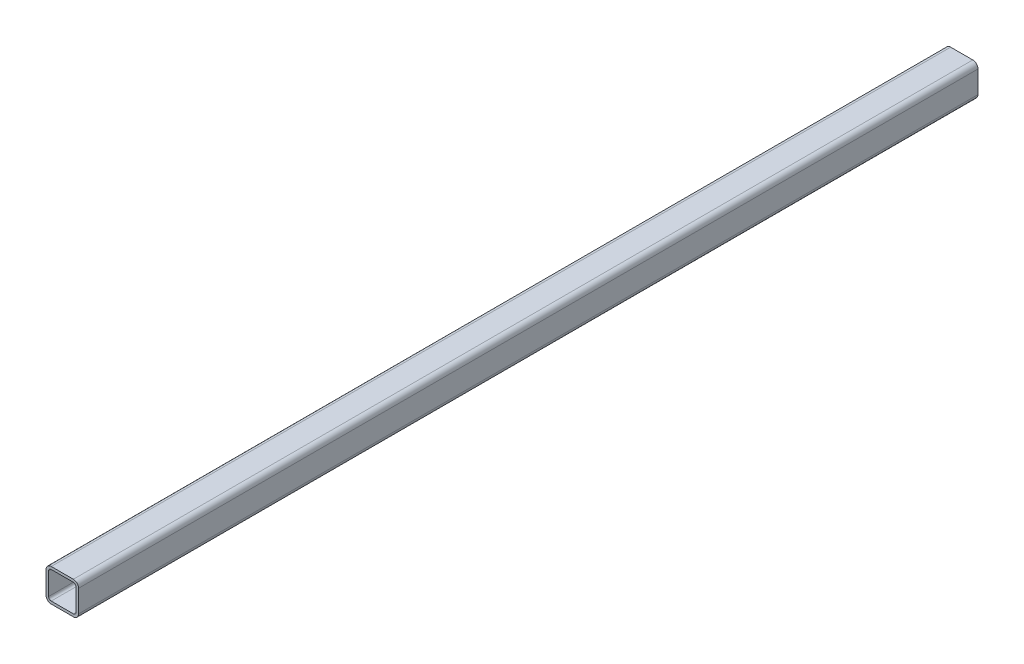
ISO-10303-21;
HEADER;
FILE_DESCRIPTION(('STEP AP214'),'2;1');
FILE_NAME('part.step','',(''),(''),'','','');
FILE_SCHEMA(('AUTOMOTIVE_DESIGN { 1 0 10303 214 1 1 1 1 }'));
ENDSEC;
DATA;
#1=APPLICATION_CONTEXT('core data for automotive mechanical design processes');
#2=APPLICATION_PROTOCOL_DEFINITION('international standard','automotive_design',2000,#1);
#3=PRODUCT_CONTEXT('',#1,'mechanical');
#4=PRODUCT('Part','Part','',(#3));
#5=PRODUCT_RELATED_PRODUCT_CATEGORY('part','',(#4));
#6=PRODUCT_DEFINITION_FORMATION('','',#4);
#7=PRODUCT_DEFINITION_CONTEXT('part definition',#1,'design');
#8=PRODUCT_DEFINITION('design','',#6,#7);
#9=PRODUCT_DEFINITION_SHAPE('','',#8);
#10=(LENGTH_UNIT() NAMED_UNIT(*) SI_UNIT(.MILLI.,.METRE.));
#11=(NAMED_UNIT(*) PLANE_ANGLE_UNIT() SI_UNIT($,.RADIAN.));
#12=(NAMED_UNIT(*) SI_UNIT($,.STERADIAN.) SOLID_ANGLE_UNIT());
#13=UNCERTAINTY_MEASURE_WITH_UNIT(LENGTH_MEASURE(1.E-05),#10,'distance_accuracy_value','');
#14=(GEOMETRIC_REPRESENTATION_CONTEXT(3) GLOBAL_UNCERTAINTY_ASSIGNED_CONTEXT((#13)) GLOBAL_UNIT_ASSIGNED_CONTEXT((#10,
#11,#12)) REPRESENTATION_CONTEXT('',''));
#15=CARTESIAN_POINT('',(0.,0.,0.));
#16=DIRECTION('',(0.,0.,1.));
#17=DIRECTION('',(1.,0.,0.));
#18=AXIS2_PLACEMENT_3D('',#15,#16,#17);
#19=CARTESIAN_POINT('',(-1206.,-1224.,220.));
#20=DIRECTION('',(-1.,0.,0.));
#21=DIRECTION('',(0.,0.,1.));
#22=AXIS2_PLACEMENT_3D('',#19,#20,#21);
#23=CYLINDRICAL_SURFACE('',#22,2.49999999999995);
#24=CARTESIAN_POINT('',(-1200.,-1224.,220.));
#25=DIRECTION('',(-1.,0.,0.));
#26=DIRECTION('',(0.,0.,1.));
#27=AXIS2_PLACEMENT_3D('',#24,#25,#26);
#28=CIRCLE('',#27,2.49999999999995);
#29=CARTESIAN_POINT('',(-1200.,-1224.,222.5));
#30=VERTEX_POINT('',#29);
#31=EDGE_CURVE('E22',#30,#30,#28,.T.);
#32=ORIENTED_EDGE('',*,*,#31,.T.);
#33=EDGE_LOOP('',(#32));
#34=FACE_BOUND('',#33,.T.);
#35=CARTESIAN_POINT('',(-1196.8,-1224.,220.));
#36=DIRECTION('',(-1.,0.,0.));
#37=DIRECTION('',(0.,0.,1.));
#38=AXIS2_PLACEMENT_3D('',#35,#36,#37);
#39=CIRCLE('',#38,2.49999999999995);
#40=CARTESIAN_POINT('',(-1196.8,-1224.,222.5));
#41=VERTEX_POINT('',#40);
#42=EDGE_CURVE('E167',#41,#41,#39,.T.);
#43=ORIENTED_EDGE('',*,*,#42,.F.);
#44=EDGE_LOOP('',(#43));
#45=FACE_BOUND('',#44,.T.);
#46=ADVANCED_FACE('F19',(#34,#45),#23,.F.);
#47=CARTESIAN_POINT('',(-1206.,-1224.,100.));
#48=DIRECTION('',(-1.,0.,0.));
#49=DIRECTION('',(0.,0.,1.));
#50=AXIS2_PLACEMENT_3D('',#47,#48,#49);
#51=CYLINDRICAL_SURFACE('',#50,2.49999999999995);
#52=CARTESIAN_POINT('',(-1200.,-1224.,100.));
#53=DIRECTION('',(-1.,0.,0.));
#54=DIRECTION('',(0.,0.,1.));
#55=AXIS2_PLACEMENT_3D('',#52,#53,#54);
#56=CIRCLE('',#55,2.49999999999995);
#57=CARTESIAN_POINT('',(-1200.,-1224.,102.5));
#58=VERTEX_POINT('',#57);
#59=EDGE_CURVE('E279',#58,#58,#56,.T.);
#60=ORIENTED_EDGE('',*,*,#59,.T.);
#61=EDGE_LOOP('',(#60));
#62=FACE_BOUND('',#61,.T.);
#63=CARTESIAN_POINT('',(-1196.8,-1224.,100.));
#64=DIRECTION('',(-1.,0.,0.));
#65=DIRECTION('',(0.,0.,1.));
#66=AXIS2_PLACEMENT_3D('',#63,#64,#65);
#67=CIRCLE('',#66,2.49999999999995);
#68=CARTESIAN_POINT('',(-1196.8,-1224.,102.5));
#69=VERTEX_POINT('',#68);
#70=EDGE_CURVE('E162',#69,#69,#67,.T.);
#71=ORIENTED_EDGE('',*,*,#70,.F.);
#72=EDGE_LOOP('',(#71));
#73=FACE_BOUND('',#72,.T.);
#74=ADVANCED_FACE('F444',(#62,#73),#51,.F.);
#75=CARTESIAN_POINT('',(-1200.,-1206.4,-880.));
#76=DIRECTION('',(1.,0.,0.));
#77=DIRECTION('',(0.,0.,-1.));
#78=AXIS2_PLACEMENT_3D('',#75,#76,#77);
#79=PLANE('',#78);
#80=ORIENTED_EDGE('',*,*,#59,.F.);
#81=EDGE_LOOP('',(#80));
#82=FACE_BOUND('',#81,.T.);
#83=ORIENTED_EDGE('',*,*,#31,.F.);
#84=EDGE_LOOP('',(#83));
#85=FACE_BOUND('',#84,.T.);
#86=DIRECTION('',(0.,0.,1.));
#87=VECTOR('',#86,1.);
#88=CARTESIAN_POINT('',(-1200.,-1206.4,-880.));
#89=LINE('',#88,#87);
#90=CARTESIAN_POINT('',(-1200.,-1206.4,-860.));
#91=VERTEX_POINT('',#90);
#92=CARTESIAN_POINT('',(-1200.,-1206.4,245.));
#93=VERTEX_POINT('',#92);
#94=EDGE_CURVE('E274',#91,#93,#89,.T.);
#95=ORIENTED_EDGE('',*,*,#94,.F.);
#96=DIRECTION('',(0.,1.,0.));
#97=VECTOR('',#96,1.);
#98=CARTESIAN_POINT('',(-1200.,-1240.,-860.));
#99=LINE('',#98,#97);
#100=CARTESIAN_POINT('',(-1200.,-1233.6,-860.));
#101=VERTEX_POINT('',#100);
#102=EDGE_CURVE('E199',#101,#91,#99,.T.);
#103=ORIENTED_EDGE('',*,*,#102,.F.);
#104=DIRECTION('',(0.,0.,1.));
#105=VECTOR('',#104,1.);
#106=CARTESIAN_POINT('',(-1200.,-1233.6,-880.));
#107=LINE('',#106,#105);
#108=CARTESIAN_POINT('',(-1200.,-1233.6,245.));
#109=VERTEX_POINT('',#108);
#110=EDGE_CURVE('E221',#109,#101,#107,.F.);
#111=ORIENTED_EDGE('',*,*,#110,.F.);
#112=DIRECTION('',(0.,1.,0.));
#113=VECTOR('',#112,1.);
#114=CARTESIAN_POINT('',(-1200.,-1235.4,245.));
#115=LINE('',#114,#113);
#116=EDGE_CURVE('E249',#109,#93,#115,.T.);
#117=ORIENTED_EDGE('',*,*,#116,.T.);
#118=EDGE_LOOP('',(#95,#103,#111,#117));
#119=FACE_BOUND('',#118,.T.);
#120=ADVANCED_FACE('F273',(#82,#85,#119),#79,.F.);
#121=CARTESIAN_POINT('',(-1193.6,-1206.4,-880.));
#122=DIRECTION('',(0.,0.,1.));
#123=DIRECTION('',(1.,0.,0.));
#124=AXIS2_PLACEMENT_3D('',#121,#122,#123);
#125=CYLINDRICAL_SURFACE('',#124,6.39999999999996);
#126=ORIENTED_EDGE('',*,*,#94,.T.);
#127=CARTESIAN_POINT('',(-1193.6,-1206.4,245.));
#128=DIRECTION('',(0.,0.,1.));
#129=DIRECTION('',(1.,0.,0.));
#130=AXIS2_PLACEMENT_3D('',#127,#128,#129);
#131=CIRCLE('',#130,6.39999999999996);
#132=CARTESIAN_POINT('',(-1193.6,-1200.,245.));
#133=VERTEX_POINT('',#132);
#134=EDGE_CURVE('E248',#93,#133,#131,.F.);
#135=ORIENTED_EDGE('',*,*,#134,.T.);
#136=DIRECTION('',(0.,0.,-1.));
#137=VECTOR('',#136,1.);
#138=CARTESIAN_POINT('',(-1193.6,-1200.,-880.));
#139=LINE('',#138,#137);
#140=CARTESIAN_POINT('',(-1193.6,-1200.,-860.));
#141=VERTEX_POINT('',#140);
#142=EDGE_CURVE('E278',#133,#141,#139,.T.);
#143=ORIENTED_EDGE('',*,*,#142,.T.);
#144=CARTESIAN_POINT('',(-1193.6,-1206.4,-860.));
#145=DIRECTION('',(0.,0.,1.));
#146=DIRECTION('',(1.,0.,0.));
#147=AXIS2_PLACEMENT_3D('',#144,#145,#146);
#148=CIRCLE('',#147,6.39999999999996);
#149=EDGE_CURVE('E198',#91,#141,#148,.F.);
#150=ORIENTED_EDGE('',*,*,#149,.F.);
#151=EDGE_LOOP('',(#126,#135,#143,#150));
#152=FACE_BOUND('',#151,.T.);
#153=ADVANCED_FACE('F281',(#152),#125,.T.);
#154=CARTESIAN_POINT('',(-1193.6,-1200.,-880.));
#155=DIRECTION('',(0.,-1.,0.));
#156=DIRECTION('',(0.,0.,-1.));
#157=AXIS2_PLACEMENT_3D('',#154,#155,#156);
#158=PLANE('',#157);
#159=DIRECTION('',(0.,0.,1.));
#160=VECTOR('',#159,1.);
#161=CARTESIAN_POINT('',(-1166.4,-1200.,-880.));
#162=LINE('',#161,#160);
#163=CARTESIAN_POINT('',(-1166.4,-1200.,-860.));
#164=VERTEX_POINT('',#163);
#165=CARTESIAN_POINT('',(-1166.4,-1200.,245.));
#166=VERTEX_POINT('',#165);
#167=EDGE_CURVE('E126',#164,#166,#162,.T.);
#168=ORIENTED_EDGE('',*,*,#167,.F.);
#169=DIRECTION('',(1.,0.,0.));
#170=VECTOR('',#169,1.);
#171=CARTESIAN_POINT('',(-1166.4,-1200.,-860.));
#172=LINE('',#171,#170);
#173=EDGE_CURVE('E154',#141,#164,#172,.T.);
#174=ORIENTED_EDGE('',*,*,#173,.F.);
#175=ORIENTED_EDGE('',*,*,#142,.F.);
#176=DIRECTION('',(-1.,0.,0.));
#177=VECTOR('',#176,1.);
#178=CARTESIAN_POINT('',(-1164.6,-1200.,245.));
#179=LINE('',#178,#177);
#180=EDGE_CURVE('E247',#133,#166,#179,.F.);
#181=ORIENTED_EDGE('',*,*,#180,.T.);
#182=EDGE_LOOP('',(#168,#174,#175,#181));
#183=FACE_BOUND('',#182,.T.);
#184=ADVANCED_FACE('F284',(#183),#158,.F.);
#185=CARTESIAN_POINT('',(-1166.4,-1206.4,-880.));
#186=DIRECTION('',(0.,0.,1.));
#187=DIRECTION('',(1.,0.,0.));
#188=AXIS2_PLACEMENT_3D('',#185,#186,#187);
#189=CYLINDRICAL_SURFACE('',#188,6.39999999999996);
#190=ORIENTED_EDGE('',*,*,#167,.T.);
#191=CARTESIAN_POINT('',(-1166.4,-1206.4,245.));
#192=DIRECTION('',(0.,0.,1.));
#193=DIRECTION('',(1.,0.,0.));
#194=AXIS2_PLACEMENT_3D('',#191,#192,#193);
#195=CIRCLE('',#194,6.39999999999996);
#196=CARTESIAN_POINT('',(-1160.,-1206.4,245.));
#197=VERTEX_POINT('',#196);
#198=EDGE_CURVE('E138',#166,#197,#195,.F.);
#199=ORIENTED_EDGE('',*,*,#198,.T.);
#200=DIRECTION('',(0.,0.,1.));
#201=VECTOR('',#200,1.);
#202=CARTESIAN_POINT('',(-1160.,-1206.4,-880.));
#203=LINE('',#202,#201);
#204=CARTESIAN_POINT('',(-1160.,-1206.4,-860.));
#205=VERTEX_POINT('',#204);
#206=EDGE_CURVE('E131',#197,#205,#203,.F.);
#207=ORIENTED_EDGE('',*,*,#206,.T.);
#208=CARTESIAN_POINT('',(-1166.4,-1206.4,-860.));
#209=DIRECTION('',(0.,0.,1.));
#210=DIRECTION('',(1.,0.,0.));
#211=AXIS2_PLACEMENT_3D('',#208,#209,#210);
#212=CIRCLE('',#211,6.39999999999996);
#213=EDGE_CURVE('E135',#164,#205,#212,.F.);
#214=ORIENTED_EDGE('',*,*,#213,.F.);
#215=EDGE_LOOP('',(#190,#199,#207,#214));
#216=FACE_BOUND('',#215,.T.);
#217=ADVANCED_FACE('F133',(#216),#189,.T.);
#218=CARTESIAN_POINT('',(-1160.,-1233.6,-880.));
#219=DIRECTION('',(-1.,0.,0.));
#220=DIRECTION('',(0.,0.,1.));
#221=AXIS2_PLACEMENT_3D('',#218,#219,#220);
#222=PLANE('',#221);
#223=DIRECTION('',(0.,0.,1.));
#224=VECTOR('',#223,1.);
#225=CARTESIAN_POINT('',(-1160.,-1233.6,-880.));
#226=LINE('',#225,#224);
#227=CARTESIAN_POINT('',(-1160.,-1233.6,-860.));
#228=VERTEX_POINT('',#227);
#229=CARTESIAN_POINT('',(-1160.,-1233.6,245.));
#230=VERTEX_POINT('',#229);
#231=EDGE_CURVE('E141',#228,#230,#226,.T.);
#232=ORIENTED_EDGE('',*,*,#231,.F.);
#233=DIRECTION('',(0.,1.,0.));
#234=VECTOR('',#233,1.);
#235=CARTESIAN_POINT('',(-1160.,-1240.,-860.));
#236=LINE('',#235,#234);
#237=EDGE_CURVE('E144',#205,#228,#236,.F.);
#238=ORIENTED_EDGE('',*,*,#237,.F.);
#239=ORIENTED_EDGE('',*,*,#206,.F.);
#240=DIRECTION('',(0.,1.,0.));
#241=VECTOR('',#240,1.);
#242=CARTESIAN_POINT('',(-1160.,-1235.4,245.));
#243=LINE('',#242,#241);
#244=EDGE_CURVE('E245',#197,#230,#243,.F.);
#245=ORIENTED_EDGE('',*,*,#244,.T.);
#246=EDGE_LOOP('',(#232,#238,#239,#245));
#247=FACE_BOUND('',#246,.T.);
#248=ADVANCED_FACE('F145',(#247),#222,.F.);
#249=CARTESIAN_POINT('',(-1166.4,-1233.6,-880.));
#250=DIRECTION('',(0.,0.,1.));
#251=DIRECTION('',(1.,0.,0.));
#252=AXIS2_PLACEMENT_3D('',#249,#250,#251);
#253=CYLINDRICAL_SURFACE('',#252,6.39999999999996);
#254=ORIENTED_EDGE('',*,*,#231,.T.);
#255=CARTESIAN_POINT('',(-1166.4,-1233.6,245.));
#256=DIRECTION('',(0.,0.,1.));
#257=DIRECTION('',(1.,0.,0.));
#258=AXIS2_PLACEMENT_3D('',#255,#256,#257);
#259=CIRCLE('',#258,6.39999999999996);
#260=CARTESIAN_POINT('',(-1166.4,-1240.,245.));
#261=VERTEX_POINT('',#260);
#262=EDGE_CURVE('E244',#230,#261,#259,.F.);
#263=ORIENTED_EDGE('',*,*,#262,.T.);
#264=DIRECTION('',(0.,0.,1.));
#265=VECTOR('',#264,1.);
#266=CARTESIAN_POINT('',(-1166.4,-1240.,-880.));
#267=LINE('',#266,#265);
#268=CARTESIAN_POINT('',(-1166.4,-1240.,-860.));
#269=VERTEX_POINT('',#268);
#270=EDGE_CURVE('E223',#261,#269,#267,.F.);
#271=ORIENTED_EDGE('',*,*,#270,.T.);
#272=CARTESIAN_POINT('',(-1166.4,-1233.6,-860.));
#273=DIRECTION('',(0.,0.,1.));
#274=DIRECTION('',(1.,0.,0.));
#275=AXIS2_PLACEMENT_3D('',#272,#273,#274);
#276=CIRCLE('',#275,6.39999999999996);
#277=EDGE_CURVE('E150',#228,#269,#276,.F.);
#278=ORIENTED_EDGE('',*,*,#277,.F.);
#279=EDGE_LOOP('',(#254,#263,#271,#278));
#280=FACE_BOUND('',#279,.T.);
#281=ADVANCED_FACE('F339',(#280),#253,.T.);
#282=CARTESIAN_POINT('',(-1166.4,-1240.,-880.));
#283=DIRECTION('',(0.,1.,0.));
#284=DIRECTION('',(0.,0.,1.));
#285=AXIS2_PLACEMENT_3D('',#282,#283,#284);
#286=PLANE('',#285);
#287=DIRECTION('',(0.,0.,1.));
#288=VECTOR('',#287,1.);
#289=CARTESIAN_POINT('',(-1193.6,-1240.,-880.));
#290=LINE('',#289,#288);
#291=CARTESIAN_POINT('',(-1193.6,-1240.,-860.));
#292=VERTEX_POINT('',#291);
#293=CARTESIAN_POINT('',(-1193.6,-1240.,245.));
#294=VERTEX_POINT('',#293);
#295=EDGE_CURVE('E217',#292,#294,#290,.T.);
#296=ORIENTED_EDGE('',*,*,#295,.F.);
#297=DIRECTION('',(1.,0.,0.));
#298=VECTOR('',#297,1.);
#299=CARTESIAN_POINT('',(-1166.4,-1240.,-860.));
#300=LINE('',#299,#298);
#301=EDGE_CURVE('E203',#269,#292,#300,.F.);
#302=ORIENTED_EDGE('',*,*,#301,.F.);
#303=ORIENTED_EDGE('',*,*,#270,.F.);
#304=DIRECTION('',(-1.,0.,0.));
#305=VECTOR('',#304,1.);
#306=CARTESIAN_POINT('',(-1164.6,-1240.,245.));
#307=LINE('',#306,#305);
#308=EDGE_CURVE('E241',#261,#294,#307,.T.);
#309=ORIENTED_EDGE('',*,*,#308,.T.);
#310=EDGE_LOOP('',(#296,#302,#303,#309));
#311=FACE_BOUND('',#310,.T.);
#312=ADVANCED_FACE('F336',(#311),#286,.F.);
#313=CARTESIAN_POINT('',(-1193.6,-1233.6,-880.));
#314=DIRECTION('',(0.,0.,1.));
#315=DIRECTION('',(1.,0.,0.));
#316=AXIS2_PLACEMENT_3D('',#313,#314,#315);
#317=CYLINDRICAL_SURFACE('',#316,6.39999999999996);
#318=ORIENTED_EDGE('',*,*,#295,.T.);
#319=CARTESIAN_POINT('',(-1193.6,-1233.6,245.));
#320=DIRECTION('',(0.,0.,1.));
#321=DIRECTION('',(1.,0.,0.));
#322=AXIS2_PLACEMENT_3D('',#319,#320,#321);
#323=CIRCLE('',#322,6.39999999999996);
#324=EDGE_CURVE('E243',#294,#109,#323,.F.);
#325=ORIENTED_EDGE('',*,*,#324,.T.);
#326=ORIENTED_EDGE('',*,*,#110,.T.);
#327=CARTESIAN_POINT('',(-1193.6,-1233.6,-860.));
#328=DIRECTION('',(0.,0.,1.));
#329=DIRECTION('',(1.,0.,0.));
#330=AXIS2_PLACEMENT_3D('',#327,#328,#329);
#331=CIRCLE('',#330,6.39999999999996);
#332=EDGE_CURVE('E202',#292,#101,#331,.F.);
#333=ORIENTED_EDGE('',*,*,#332,.F.);
#334=EDGE_LOOP('',(#318,#325,#326,#333));
#335=FACE_BOUND('',#334,.T.);
#336=ADVANCED_FACE('F270',(#335),#317,.T.);
#337=CARTESIAN_POINT('',(-1193.6,-1206.4,-880.));
#338=DIRECTION('',(0.,0.,1.));
#339=DIRECTION('',(1.,0.,0.));
#340=AXIS2_PLACEMENT_3D('',#337,#338,#339);
#341=CYLINDRICAL_SURFACE('',#340,3.19999999999987);
#342=CARTESIAN_POINT('',(-1193.6,-1206.4,-860.));
#343=DIRECTION('',(0.,0.,1.));
#344=DIRECTION('',(1.,0.,0.));
#345=AXIS2_PLACEMENT_3D('',#342,#343,#344);
#346=CIRCLE('',#345,3.19999999999987);
#347=CARTESIAN_POINT('',(-1193.6,-1203.2,-860.));
#348=VERTEX_POINT('',#347);
#349=CARTESIAN_POINT('',(-1196.8,-1206.4,-860.));
#350=VERTEX_POINT('',#349);
#351=EDGE_CURVE('E189',#348,#350,#346,.T.);
#352=ORIENTED_EDGE('',*,*,#351,.F.);
#353=DIRECTION('',(0.,0.,-1.));
#354=VECTOR('',#353,1.);
#355=CARTESIAN_POINT('',(-1193.6,-1203.2,-880.));
#356=LINE('',#355,#354);
#357=CARTESIAN_POINT('',(-1193.6,-1203.2,245.));
#358=VERTEX_POINT('',#357);
#359=EDGE_CURVE('E157',#358,#348,#356,.T.);
#360=ORIENTED_EDGE('',*,*,#359,.F.);
#361=CARTESIAN_POINT('',(-1193.6,-1206.4,245.));
#362=DIRECTION('',(0.,0.,1.));
#363=DIRECTION('',(1.,0.,0.));
#364=AXIS2_PLACEMENT_3D('',#361,#362,#363);
#365=CIRCLE('',#364,3.19999999999987);
#366=CARTESIAN_POINT('',(-1196.8,-1206.4,245.));
#367=VERTEX_POINT('',#366);
#368=EDGE_CURVE('E240',#358,#367,#365,.T.);
#369=ORIENTED_EDGE('',*,*,#368,.T.);
#370=DIRECTION('',(0.,0.,-1.));
#371=VECTOR('',#370,1.);
#372=CARTESIAN_POINT('',(-1196.8,-1206.4,-880.));
#373=LINE('',#372,#371);
#374=EDGE_CURVE('E215',#350,#367,#373,.F.);
#375=ORIENTED_EDGE('',*,*,#374,.F.);
#376=EDGE_LOOP('',(#352,#360,#369,#375));
#377=FACE_BOUND('',#376,.T.);
#378=ADVANCED_FACE('F329',(#377),#341,.F.);
#379=CARTESIAN_POINT('',(-1196.8,-1206.4,-880.));
#380=DIRECTION('',(1.,0.,0.));
#381=DIRECTION('',(0.,0.,-1.));
#382=AXIS2_PLACEMENT_3D('',#379,#380,#381);
#383=PLANE('',#382);
#384=ORIENTED_EDGE('',*,*,#70,.T.);
#385=EDGE_LOOP('',(#384));
#386=FACE_BOUND('',#385,.T.);
#387=ORIENTED_EDGE('',*,*,#42,.T.);
#388=EDGE_LOOP('',(#387));
#389=FACE_BOUND('',#388,.T.);
#390=DIRECTION('',(0.,1.,0.));
#391=VECTOR('',#390,1.);
#392=CARTESIAN_POINT('',(-1196.8,-1235.4,245.));
#393=LINE('',#392,#391);
#394=CARTESIAN_POINT('',(-1196.8,-1233.6,245.));
#395=VERTEX_POINT('',#394);
#396=EDGE_CURVE('E238',#367,#395,#393,.F.);
#397=ORIENTED_EDGE('',*,*,#396,.T.);
#398=DIRECTION('',(0.,0.,1.));
#399=VECTOR('',#398,1.);
#400=CARTESIAN_POINT('',(-1196.8,-1233.6,-880.));
#401=LINE('',#400,#399);
#402=CARTESIAN_POINT('',(-1196.8,-1233.6,-860.));
#403=VERTEX_POINT('',#402);
#404=EDGE_CURVE('E212',#395,#403,#401,.F.);
#405=ORIENTED_EDGE('',*,*,#404,.T.);
#406=DIRECTION('',(0.,1.,0.));
#407=VECTOR('',#406,1.);
#408=CARTESIAN_POINT('',(-1196.8,-1240.,-860.));
#409=LINE('',#408,#407);
#410=EDGE_CURVE('E194',#350,#403,#409,.F.);
#411=ORIENTED_EDGE('',*,*,#410,.F.);
#412=ORIENTED_EDGE('',*,*,#374,.T.);
#413=EDGE_LOOP('',(#397,#405,#411,#412));
#414=FACE_BOUND('',#413,.T.);
#415=ADVANCED_FACE('F325',(#386,#389,#414),#383,.T.);
#416=CARTESIAN_POINT('',(-1166.4,-1206.4,-880.));
#417=DIRECTION('',(0.,0.,1.));
#418=DIRECTION('',(1.,0.,0.));
#419=AXIS2_PLACEMENT_3D('',#416,#417,#418);
#420=CYLINDRICAL_SURFACE('',#419,3.19999999999987);
#421=CARTESIAN_POINT('',(-1166.4,-1206.4,-860.));
#422=DIRECTION('',(0.,0.,1.));
#423=DIRECTION('',(1.,0.,0.));
#424=AXIS2_PLACEMENT_3D('',#421,#422,#423);
#425=CIRCLE('',#424,3.19999999999987);
#426=CARTESIAN_POINT('',(-1163.2,-1206.4,-860.));
#427=VERTEX_POINT('',#426);
#428=CARTESIAN_POINT('',(-1166.4,-1203.2,-860.));
#429=VERTEX_POINT('',#428);
#430=EDGE_CURVE('E190',#427,#429,#425,.T.);
#431=ORIENTED_EDGE('',*,*,#430,.F.);
#432=DIRECTION('',(0.,0.,1.));
#433=VECTOR('',#432,1.);
#434=CARTESIAN_POINT('',(-1163.2,-1206.4,-880.));
#435=LINE('',#434,#433);
#436=CARTESIAN_POINT('',(-1163.2,-1206.4,245.));
#437=VERTEX_POINT('',#436);
#438=EDGE_CURVE('E155',#437,#427,#435,.F.);
#439=ORIENTED_EDGE('',*,*,#438,.F.);
#440=CARTESIAN_POINT('',(-1166.4,-1206.4,245.));
#441=DIRECTION('',(0.,0.,1.));
#442=DIRECTION('',(1.,0.,0.));
#443=AXIS2_PLACEMENT_3D('',#440,#441,#442);
#444=CIRCLE('',#443,3.19999999999987);
#445=CARTESIAN_POINT('',(-1166.4,-1203.2,245.));
#446=VERTEX_POINT('',#445);
#447=EDGE_CURVE('E234',#437,#446,#444,.T.);
#448=ORIENTED_EDGE('',*,*,#447,.T.);
#449=DIRECTION('',(0.,0.,-1.));
#450=VECTOR('',#449,1.);
#451=CARTESIAN_POINT('',(-1166.4,-1203.2,-880.));
#452=LINE('',#451,#450);
#453=EDGE_CURVE('E166',#429,#446,#452,.F.);
#454=ORIENTED_EDGE('',*,*,#453,.F.);
#455=EDGE_LOOP('',(#431,#439,#448,#454));
#456=FACE_BOUND('',#455,.T.);
#457=ADVANCED_FACE('F321',(#456),#420,.F.);
#458=CARTESIAN_POINT('',(-1193.6,-1203.2,-880.));
#459=DIRECTION('',(0.,-1.,0.));
#460=DIRECTION('',(0.,0.,-1.));
#461=AXIS2_PLACEMENT_3D('',#458,#459,#460);
#462=PLANE('',#461);
#463=DIRECTION('',(-1.,0.,0.));
#464=VECTOR('',#463,1.);
#465=CARTESIAN_POINT('',(-1164.6,-1203.2,245.));
#466=LINE('',#465,#464);
#467=EDGE_CURVE('E236',#446,#358,#466,.T.);
#468=ORIENTED_EDGE('',*,*,#467,.T.);
#469=ORIENTED_EDGE('',*,*,#359,.T.);
#470=DIRECTION('',(1.,0.,0.));
#471=VECTOR('',#470,1.);
#472=CARTESIAN_POINT('',(-1166.4,-1203.2,-860.));
#473=LINE('',#472,#471);
#474=EDGE_CURVE('E186',#429,#348,#473,.F.);
#475=ORIENTED_EDGE('',*,*,#474,.F.);
#476=ORIENTED_EDGE('',*,*,#453,.T.);
#477=EDGE_LOOP('',(#468,#469,#475,#476));
#478=FACE_BOUND('',#477,.T.);
#479=ADVANCED_FACE('F317',(#478),#462,.T.);
#480=CARTESIAN_POINT('',(-1163.2,-1233.6,-880.));
#481=DIRECTION('',(-1.,0.,0.));
#482=DIRECTION('',(0.,0.,1.));
#483=AXIS2_PLACEMENT_3D('',#480,#481,#482);
#484=PLANE('',#483);
#485=DIRECTION('',(0.,1.,0.));
#486=VECTOR('',#485,1.);
#487=CARTESIAN_POINT('',(-1163.2,-1235.4,245.));
#488=LINE('',#487,#486);
#489=CARTESIAN_POINT('',(-1163.2,-1233.6,245.));
#490=VERTEX_POINT('',#489);
#491=EDGE_CURVE('E229',#490,#437,#488,.T.);
#492=ORIENTED_EDGE('',*,*,#491,.T.);
#493=ORIENTED_EDGE('',*,*,#438,.T.);
#494=DIRECTION('',(0.,1.,0.));
#495=VECTOR('',#494,1.);
#496=CARTESIAN_POINT('',(-1163.2,-1240.,-860.));
#497=LINE('',#496,#495);
#498=CARTESIAN_POINT('',(-1163.2,-1233.6,-860.));
#499=VERTEX_POINT('',#498);
#500=EDGE_CURVE('E191',#499,#427,#497,.T.);
#501=ORIENTED_EDGE('',*,*,#500,.F.);
#502=DIRECTION('',(0.,0.,1.));
#503=VECTOR('',#502,1.);
#504=CARTESIAN_POINT('',(-1163.2,-1233.6,-880.));
#505=LINE('',#504,#503);
#506=EDGE_CURVE('E185',#499,#490,#505,.T.);
#507=ORIENTED_EDGE('',*,*,#506,.T.);
#508=EDGE_LOOP('',(#492,#493,#501,#507));
#509=FACE_BOUND('',#508,.T.);
#510=ADVANCED_FACE('F314',(#509),#484,.T.);
#511=CARTESIAN_POINT('',(-1166.4,-1240.,-860.));
#512=DIRECTION('',(0.,0.,-1.));
#513=DIRECTION('',(0.,1.,0.));
#514=AXIS2_PLACEMENT_3D('',#511,#512,#513);
#515=PLANE('',#514);
#516=ORIENTED_EDGE('',*,*,#474,.T.);
#517=ORIENTED_EDGE('',*,*,#351,.T.);
#518=ORIENTED_EDGE('',*,*,#410,.T.);
#519=CARTESIAN_POINT('',(-1193.6,-1233.6,-860.));
#520=DIRECTION('',(0.,0.,1.));
#521=DIRECTION('',(1.,0.,0.));
#522=AXIS2_PLACEMENT_3D('',#519,#520,#521);
#523=CIRCLE('',#522,3.20000000000009);
#524=CARTESIAN_POINT('',(-1193.6,-1236.8,-860.));
#525=VERTEX_POINT('',#524);
#526=EDGE_CURVE('E214',#403,#525,#523,.T.);
#527=ORIENTED_EDGE('',*,*,#526,.T.);
#528=DIRECTION('',(1.,0.,0.));
#529=VECTOR('',#528,1.);
#530=CARTESIAN_POINT('',(-1166.4,-1236.8,-860.));
#531=LINE('',#530,#529);
#532=CARTESIAN_POINT('',(-1166.4,-1236.8,-860.));
#533=VERTEX_POINT('',#532);
#534=EDGE_CURVE('E182',#533,#525,#531,.F.);
#535=ORIENTED_EDGE('',*,*,#534,.F.);
#536=CARTESIAN_POINT('',(-1166.4,-1233.6,-860.));
#537=DIRECTION('',(0.,0.,1.));
#538=DIRECTION('',(1.,0.,0.));
#539=AXIS2_PLACEMENT_3D('',#536,#537,#538);
#540=CIRCLE('',#539,3.19999999999987);
#541=EDGE_CURVE('E208',#533,#499,#540,.T.);
#542=ORIENTED_EDGE('',*,*,#541,.T.);
#543=ORIENTED_EDGE('',*,*,#500,.T.);
#544=ORIENTED_EDGE('',*,*,#430,.T.);
#545=EDGE_LOOP('',(#516,#517,#518,#527,#535,#542,#543,#544));
#546=FACE_BOUND('',#545,.T.);
#547=ORIENTED_EDGE('',*,*,#149,.T.);
#548=ORIENTED_EDGE('',*,*,#173,.T.);
#549=ORIENTED_EDGE('',*,*,#213,.T.);
#550=ORIENTED_EDGE('',*,*,#237,.T.);
#551=ORIENTED_EDGE('',*,*,#277,.T.);
#552=ORIENTED_EDGE('',*,*,#301,.T.);
#553=ORIENTED_EDGE('',*,*,#332,.T.);
#554=ORIENTED_EDGE('',*,*,#102,.T.);
#555=EDGE_LOOP('',(#547,#548,#549,#550,#551,#552,#553,#554));
#556=FACE_BOUND('',#555,.T.);
#557=ADVANCED_FACE('F153',(#546,#556),#515,.T.);
#558=CARTESIAN_POINT('',(-1193.6,-1233.6,-880.));
#559=DIRECTION('',(0.,0.,1.));
#560=DIRECTION('',(1.,0.,0.));
#561=AXIS2_PLACEMENT_3D('',#558,#559,#560);
#562=CYLINDRICAL_SURFACE('',#561,3.20000000000009);
#563=ORIENTED_EDGE('',*,*,#526,.F.);
#564=ORIENTED_EDGE('',*,*,#404,.F.);
#565=CARTESIAN_POINT('',(-1193.6,-1233.6,245.));
#566=DIRECTION('',(0.,0.,1.));
#567=DIRECTION('',(1.,0.,0.));
#568=AXIS2_PLACEMENT_3D('',#565,#566,#567);
#569=CIRCLE('',#568,3.20000000000009);
#570=CARTESIAN_POINT('',(-1193.6,-1236.8,245.));
#571=VERTEX_POINT('',#570);
#572=EDGE_CURVE('E235',#395,#571,#569,.T.);
#573=ORIENTED_EDGE('',*,*,#572,.T.);
#574=DIRECTION('',(0.,0.,1.));
#575=VECTOR('',#574,1.);
#576=CARTESIAN_POINT('',(-1193.6,-1236.8,-880.));
#577=LINE('',#576,#575);
#578=EDGE_CURVE('E179',#525,#571,#577,.T.);
#579=ORIENTED_EDGE('',*,*,#578,.F.);
#580=EDGE_LOOP('',(#563,#564,#573,#579));
#581=FACE_BOUND('',#580,.T.);
#582=ADVANCED_FACE('F308',(#581),#562,.F.);
#583=CARTESIAN_POINT('',(-1164.6,-1235.4,245.));
#584=DIRECTION('',(0.,0.,-1.));
#585=DIRECTION('',(-1.,0.,0.));
#586=AXIS2_PLACEMENT_3D('',#583,#584,#585);
#587=PLANE('',#586);
#588=ORIENTED_EDGE('',*,*,#447,.F.);
#589=ORIENTED_EDGE('',*,*,#491,.F.);
#590=CARTESIAN_POINT('',(-1166.4,-1233.6,245.));
#591=DIRECTION('',(0.,0.,1.));
#592=DIRECTION('',(1.,0.,0.));
#593=AXIS2_PLACEMENT_3D('',#590,#591,#592);
#594=CIRCLE('',#593,3.19999999999987);
#595=CARTESIAN_POINT('',(-1166.4,-1236.8,245.));
#596=VERTEX_POINT('',#595);
#597=EDGE_CURVE('E38',#490,#596,#594,.F.);
#598=ORIENTED_EDGE('',*,*,#597,.T.);
#599=DIRECTION('',(1.,0.,0.));
#600=VECTOR('',#599,1.);
#601=CARTESIAN_POINT('',(-1166.4,-1236.8,245.));
#602=LINE('',#601,#600);
#603=EDGE_CURVE('E29',#571,#596,#602,.T.);
#604=ORIENTED_EDGE('',*,*,#603,.F.);
#605=ORIENTED_EDGE('',*,*,#572,.F.);
#606=ORIENTED_EDGE('',*,*,#396,.F.);
#607=ORIENTED_EDGE('',*,*,#368,.F.);
#608=ORIENTED_EDGE('',*,*,#467,.F.);
#609=EDGE_LOOP('',(#588,#589,#598,#604,#605,#606,#607,#608));
#610=FACE_BOUND('',#609,.T.);
#611=ORIENTED_EDGE('',*,*,#308,.F.);
#612=ORIENTED_EDGE('',*,*,#262,.F.);
#613=ORIENTED_EDGE('',*,*,#244,.F.);
#614=ORIENTED_EDGE('',*,*,#198,.F.);
#615=ORIENTED_EDGE('',*,*,#180,.F.);
#616=ORIENTED_EDGE('',*,*,#134,.F.);
#617=ORIENTED_EDGE('',*,*,#116,.F.);
#618=ORIENTED_EDGE('',*,*,#324,.F.);
#619=EDGE_LOOP('',(#611,#612,#613,#614,#615,#616,#617,#618));
#620=FACE_BOUND('',#619,.T.);
#621=ADVANCED_FACE('F302',(#610,#620),#587,.F.);
#622=CARTESIAN_POINT('',(-1166.4,-1233.6,-880.));
#623=DIRECTION('',(0.,0.,1.));
#624=DIRECTION('',(1.,0.,0.));
#625=AXIS2_PLACEMENT_3D('',#622,#623,#624);
#626=CYLINDRICAL_SURFACE('',#625,3.19999999999987);
#627=ORIENTED_EDGE('',*,*,#541,.F.);
#628=DIRECTION('',(0.,0.,1.));
#629=VECTOR('',#628,1.);
#630=CARTESIAN_POINT('',(-1166.4,-1236.8,-880.));
#631=LINE('',#630,#629);
#632=EDGE_CURVE('E12',#596,#533,#631,.F.);
#633=ORIENTED_EDGE('',*,*,#632,.F.);
#634=ORIENTED_EDGE('',*,*,#597,.F.);
#635=ORIENTED_EDGE('',*,*,#506,.F.);
#636=EDGE_LOOP('',(#627,#633,#634,#635));
#637=FACE_BOUND('',#636,.T.);
#638=ADVANCED_FACE('F296',(#637),#626,.F.);
#639=CARTESIAN_POINT('',(-1166.4,-1236.8,-880.));
#640=DIRECTION('',(0.,1.,0.));
#641=DIRECTION('',(0.,0.,1.));
#642=AXIS2_PLACEMENT_3D('',#639,#640,#641);
#643=PLANE('',#642);
#644=ORIENTED_EDGE('',*,*,#603,.T.);
#645=ORIENTED_EDGE('',*,*,#632,.T.);
#646=ORIENTED_EDGE('',*,*,#534,.T.);
#647=ORIENTED_EDGE('',*,*,#578,.T.);
#648=EDGE_LOOP('',(#644,#645,#646,#647));
#649=FACE_BOUND('',#648,.T.);
#650=ADVANCED_FACE('F294',(#649),#643,.T.);
#651=CLOSED_SHELL('',(#46,#74,#120,#153,#184,#217,#248,#281,#312,#336,#378,#415,#457,#479,#510,
#557,#582,#621,#638,#650));
#652=MANIFOLD_SOLID_BREP('B1',#651);
#653=ADVANCED_BREP_SHAPE_REPRESENTATION('',(#18,#652),#14);
#654=SHAPE_DEFINITION_REPRESENTATION(#9,#653);
ENDSEC;
END-ISO-10303-21;
